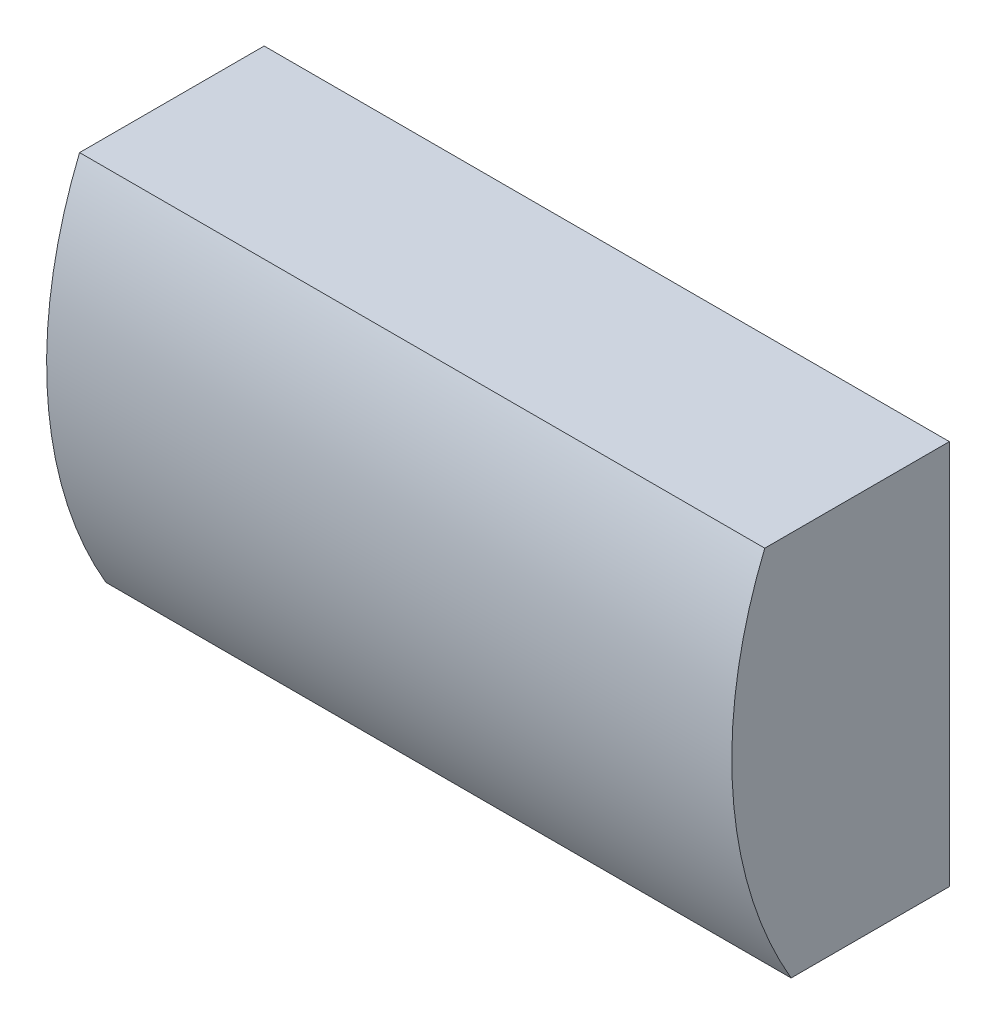
ISO-10303-21;
HEADER;
FILE_DESCRIPTION(('STEP AP214'),'2;1');
FILE_NAME('part.step','',(''),(''),'','','');
FILE_SCHEMA(('AUTOMOTIVE_DESIGN { 1 0 10303 214 1 1 1 1 }'));
ENDSEC;
DATA;
#1=APPLICATION_CONTEXT('core data for automotive mechanical design processes');
#2=APPLICATION_PROTOCOL_DEFINITION('international standard','automotive_design',2000,#1);
#3=PRODUCT_CONTEXT('',#1,'mechanical');
#4=PRODUCT('Part','Part','',(#3));
#5=PRODUCT_RELATED_PRODUCT_CATEGORY('part','',(#4));
#6=PRODUCT_DEFINITION_FORMATION('','',#4);
#7=PRODUCT_DEFINITION_CONTEXT('part definition',#1,'design');
#8=PRODUCT_DEFINITION('design','',#6,#7);
#9=PRODUCT_DEFINITION_SHAPE('','',#8);
#10=(LENGTH_UNIT() NAMED_UNIT(*) SI_UNIT(.MILLI.,.METRE.));
#11=(NAMED_UNIT(*) PLANE_ANGLE_UNIT() SI_UNIT($,.RADIAN.));
#12=(NAMED_UNIT(*) SI_UNIT($,.STERADIAN.) SOLID_ANGLE_UNIT());
#13=UNCERTAINTY_MEASURE_WITH_UNIT(LENGTH_MEASURE(1.E-05),#10,'distance_accuracy_value','');
#14=(GEOMETRIC_REPRESENTATION_CONTEXT(3) GLOBAL_UNCERTAINTY_ASSIGNED_CONTEXT((#13)) GLOBAL_UNIT_ASSIGNED_CONTEXT((#10,
#11,#12)) REPRESENTATION_CONTEXT('',''));
#15=CARTESIAN_POINT('',(0.,0.,0.));
#16=DIRECTION('',(0.,0.,1.));
#17=DIRECTION('',(1.,0.,0.));
#18=AXIS2_PLACEMENT_3D('',#15,#16,#17);
#19=CARTESIAN_POINT('',(-44.5454545454545,19.3939393939394,25.4));
#20=DIRECTION('',(1.,0.,0.));
#21=DIRECTION('',(0.,1.,0.));
#22=AXIS2_PLACEMENT_3D('',#19,#20,#21);
#23=PLANE('',#22);
#24=DIRECTION('',(0.,0.,-1.));
#25=VECTOR('',#24,1.);
#26=CARTESIAN_POINT('',(-44.5454545454545,-25.6060606060606,25.4));
#27=LINE('',#26,#25);
#28=CARTESIAN_POINT('',(-44.5454545454545,-25.6060606060606,18.4744761819301));
#29=VERTEX_POINT('',#28);
#30=CARTESIAN_POINT('',(-44.5454545454545,-25.6060606060606,0.));
#31=VERTEX_POINT('',#30);
#32=EDGE_CURVE('E62',#29,#31,#27,.T.);
#33=ORIENTED_EDGE('',*,*,#32,.F.);
#34=CARTESIAN_POINT('',(-44.5454545454545,0.,-25.4));
#35=DIRECTION('',(-1.,0.,0.));
#36=DIRECTION('',(0.,-1.,0.));
#37=AXIS2_PLACEMENT_3D('',#34,#35,#36);
#38=CIRCLE('',#37,50.8);
#39=CARTESIAN_POINT('',(-44.5454545454545,19.3939393939394,21.5522642136053));
#40=VERTEX_POINT('',#39);
#41=EDGE_CURVE('E96',#29,#40,#38,.T.);
#42=ORIENTED_EDGE('',*,*,#41,.T.);
#43=DIRECTION('',(0.,0.,-1.));
#44=VECTOR('',#43,1.);
#45=CARTESIAN_POINT('',(-44.5454545454545,19.3939393939394,25.4));
#46=LINE('',#45,#44);
#47=CARTESIAN_POINT('',(-44.5454545454545,19.3939393939394,0.));
#48=VERTEX_POINT('',#47);
#49=EDGE_CURVE('E69',#40,#48,#46,.T.);
#50=ORIENTED_EDGE('',*,*,#49,.T.);
#51=DIRECTION('',(0.,-1.,0.));
#52=VECTOR('',#51,1.);
#53=CARTESIAN_POINT('',(-44.5454545454545,19.3939393939394,0.));
#54=LINE('',#53,#52);
#55=EDGE_CURVE('E109',#48,#31,#54,.T.);
#56=ORIENTED_EDGE('',*,*,#55,.T.);
#57=EDGE_LOOP('',(#33,#42,#50,#56));
#58=FACE_BOUND('',#57,.T.);
#59=ADVANCED_FACE('F55',(#58),#23,.F.);
#60=CARTESIAN_POINT('',(35.4545454545455,19.3939393939394,25.4));
#61=DIRECTION('',(-1.,0.,0.));
#62=DIRECTION('',(0.,-1.,0.));
#63=AXIS2_PLACEMENT_3D('',#60,#61,#62);
#64=PLANE('',#63);
#65=CARTESIAN_POINT('',(35.4545454545455,0.,-25.4));
#66=DIRECTION('',(-1.,0.,0.));
#67=DIRECTION('',(0.,-1.,0.));
#68=AXIS2_PLACEMENT_3D('',#65,#66,#67);
#69=CIRCLE('',#68,50.8);
#70=CARTESIAN_POINT('',(35.4545454545455,-25.6060606060606,18.4744761819301));
#71=VERTEX_POINT('',#70);
#72=CARTESIAN_POINT('',(35.4545454545455,19.3939393939394,21.5522642136053));
#73=VERTEX_POINT('',#72);
#74=EDGE_CURVE('E121',#71,#73,#69,.T.);
#75=ORIENTED_EDGE('',*,*,#74,.F.);
#76=DIRECTION('',(0.,0.,-1.));
#77=VECTOR('',#76,1.);
#78=CARTESIAN_POINT('',(35.4545454545455,-25.6060606060606,25.4));
#79=LINE('',#78,#77);
#80=CARTESIAN_POINT('',(35.4545454545455,-25.6060606060606,0.));
#81=VERTEX_POINT('',#80);
#82=EDGE_CURVE('E107',#71,#81,#79,.T.);
#83=ORIENTED_EDGE('',*,*,#82,.T.);
#84=DIRECTION('',(0.,1.,0.));
#85=VECTOR('',#84,1.);
#86=CARTESIAN_POINT('',(35.4545454545455,19.3939393939394,0.));
#87=LINE('',#86,#85);
#88=CARTESIAN_POINT('',(35.4545454545455,19.3939393939394,0.));
#89=VERTEX_POINT('',#88);
#90=EDGE_CURVE('E116',#81,#89,#87,.T.);
#91=ORIENTED_EDGE('',*,*,#90,.T.);
#92=DIRECTION('',(0.,0.,-1.));
#93=VECTOR('',#92,1.);
#94=CARTESIAN_POINT('',(35.4545454545455,19.3939393939394,25.4));
#95=LINE('',#94,#93);
#96=EDGE_CURVE('E76',#73,#89,#95,.T.);
#97=ORIENTED_EDGE('',*,*,#96,.F.);
#98=EDGE_LOOP('',(#75,#83,#91,#97));
#99=FACE_BOUND('',#98,.T.);
#100=ADVANCED_FACE('F125',(#99),#64,.F.);
#101=CARTESIAN_POINT('',(-44.5454545454545,-25.6060606060606,25.4));
#102=DIRECTION('',(0.,1.,0.));
#103=DIRECTION('',(0.,0.,1.));
#104=AXIS2_PLACEMENT_3D('',#101,#102,#103);
#105=PLANE('',#104);
#106=DIRECTION('',(-1.,0.,0.));
#107=VECTOR('',#106,1.);
#108=CARTESIAN_POINT('',(57.0545454545455,-25.6060606060606,18.4744761819301));
#109=LINE('',#108,#107);
#110=EDGE_CURVE('E12',#29,#71,#109,.F.);
#111=ORIENTED_EDGE('',*,*,#110,.F.);
#112=ORIENTED_EDGE('',*,*,#32,.T.);
#113=DIRECTION('',(1.,0.,0.));
#114=VECTOR('',#113,1.);
#115=CARTESIAN_POINT('',(-44.5454545454545,-25.6060606060606,0.));
#116=LINE('',#115,#114);
#117=EDGE_CURVE('E118',#31,#81,#116,.T.);
#118=ORIENTED_EDGE('',*,*,#117,.T.);
#119=ORIENTED_EDGE('',*,*,#82,.F.);
#120=EDGE_LOOP('',(#111,#112,#118,#119));
#121=FACE_BOUND('',#120,.T.);
#122=ADVANCED_FACE('F104',(#121),#105,.F.);
#123=CARTESIAN_POINT('',(-44.5454545454545,19.3939393939394,25.4));
#124=DIRECTION('',(0.,-1.,0.));
#125=DIRECTION('',(0.,0.,-1.));
#126=AXIS2_PLACEMENT_3D('',#123,#124,#125);
#127=PLANE('',#126);
#128=DIRECTION('',(-1.,0.,0.));
#129=VECTOR('',#128,1.);
#130=CARTESIAN_POINT('',(57.0545454545454,19.3939393939394,21.5522642136053));
#131=LINE('',#130,#129);
#132=EDGE_CURVE('E100',#73,#40,#131,.T.);
#133=ORIENTED_EDGE('',*,*,#132,.F.);
#134=ORIENTED_EDGE('',*,*,#96,.T.);
#135=DIRECTION('',(-1.,0.,0.));
#136=VECTOR('',#135,1.);
#137=CARTESIAN_POINT('',(-44.5454545454545,19.3939393939394,0.));
#138=LINE('',#137,#136);
#139=EDGE_CURVE('E114',#89,#48,#138,.T.);
#140=ORIENTED_EDGE('',*,*,#139,.T.);
#141=ORIENTED_EDGE('',*,*,#49,.F.);
#142=EDGE_LOOP('',(#133,#134,#140,#141));
#143=FACE_BOUND('',#142,.T.);
#144=ADVANCED_FACE('F124',(#143),#127,.F.);
#145=CARTESIAN_POINT('',(0.,0.,0.));
#146=DIRECTION('',(0.,0.,1.));
#147=DIRECTION('',(1.,0.,0.));
#148=AXIS2_PLACEMENT_3D('',#145,#146,#147);
#149=PLANE('',#148);
#150=ORIENTED_EDGE('',*,*,#55,.F.);
#151=ORIENTED_EDGE('',*,*,#139,.F.);
#152=ORIENTED_EDGE('',*,*,#90,.F.);
#153=ORIENTED_EDGE('',*,*,#117,.F.);
#154=EDGE_LOOP('',(#150,#151,#152,#153));
#155=FACE_BOUND('',#154,.T.);
#156=ADVANCED_FACE('F129',(#155),#149,.F.);
#157=CARTESIAN_POINT('',(57.0545454545455,0.,-25.4));
#158=DIRECTION('',(-1.,0.,0.));
#159=DIRECTION('',(0.,-1.,0.));
#160=AXIS2_PLACEMENT_3D('',#157,#158,#159);
#161=CYLINDRICAL_SURFACE('',#160,50.8);
#162=ORIENTED_EDGE('',*,*,#74,.T.);
#163=ORIENTED_EDGE('',*,*,#132,.T.);
#164=ORIENTED_EDGE('',*,*,#41,.F.);
#165=ORIENTED_EDGE('',*,*,#110,.T.);
#166=EDGE_LOOP('',(#162,#163,#164,#165));
#167=FACE_BOUND('',#166,.T.);
#168=ADVANCED_FACE('F98',(#167),#161,.T.);
#169=CLOSED_SHELL('',(#59,#100,#122,#144,#156,#168));
#170=MANIFOLD_SOLID_BREP('B2',#169);
#171=ADVANCED_BREP_SHAPE_REPRESENTATION('',(#18,#170),#14);
#172=SHAPE_DEFINITION_REPRESENTATION(#9,#171);
ENDSEC;
END-ISO-10303-21;
